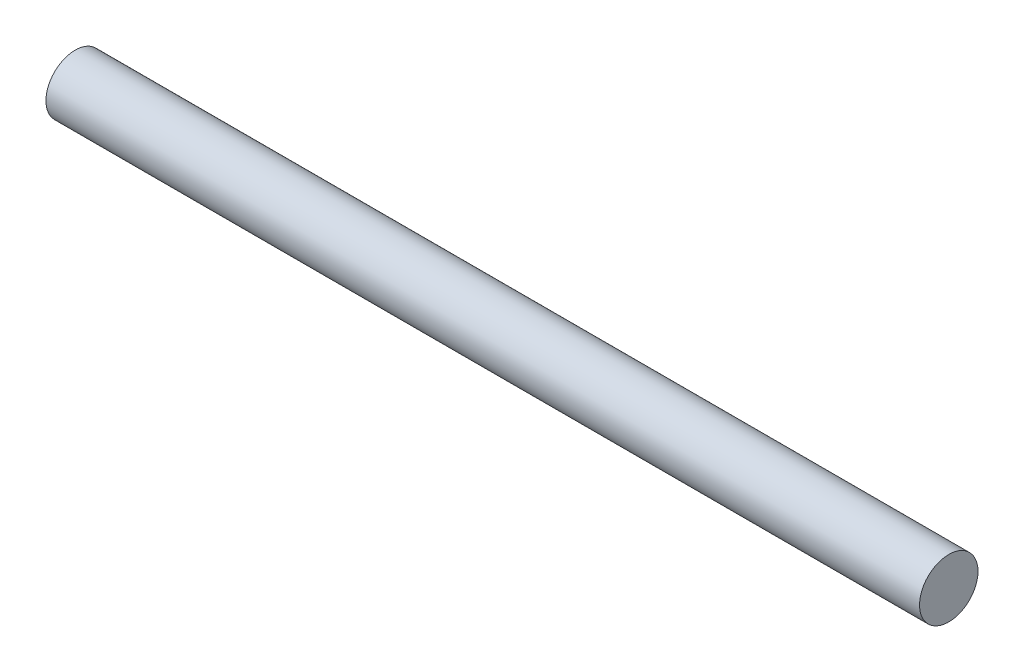
ISO-10303-21;
HEADER;
FILE_DESCRIPTION(('STEP AP214'),'2;1');
FILE_NAME('part.step','',(''),(''),'','','');
FILE_SCHEMA(('AUTOMOTIVE_DESIGN { 1 0 10303 214 1 1 1 1 }'));
ENDSEC;
DATA;
#1=APPLICATION_CONTEXT('core data for automotive mechanical design processes');
#2=APPLICATION_PROTOCOL_DEFINITION('international standard','automotive_design',2000,#1);
#3=PRODUCT_CONTEXT('',#1,'mechanical');
#4=PRODUCT('Part','Part','',(#3));
#5=PRODUCT_RELATED_PRODUCT_CATEGORY('part','',(#4));
#6=PRODUCT_DEFINITION_FORMATION('','',#4);
#7=PRODUCT_DEFINITION_CONTEXT('part definition',#1,'design');
#8=PRODUCT_DEFINITION('design','',#6,#7);
#9=PRODUCT_DEFINITION_SHAPE('','',#8);
#10=(LENGTH_UNIT() NAMED_UNIT(*) SI_UNIT(.MILLI.,.METRE.));
#11=(NAMED_UNIT(*) PLANE_ANGLE_UNIT() SI_UNIT($,.RADIAN.));
#12=(NAMED_UNIT(*) SI_UNIT($,.STERADIAN.) SOLID_ANGLE_UNIT());
#13=UNCERTAINTY_MEASURE_WITH_UNIT(LENGTH_MEASURE(1.E-05),#10,'distance_accuracy_value','');
#14=(GEOMETRIC_REPRESENTATION_CONTEXT(3) GLOBAL_UNCERTAINTY_ASSIGNED_CONTEXT((#13)) GLOBAL_UNIT_ASSIGNED_CONTEXT((#10,
#11,#12)) REPRESENTATION_CONTEXT('',''));
#15=CARTESIAN_POINT('',(0.,0.,0.));
#16=DIRECTION('',(0.,0.,1.));
#17=DIRECTION('',(1.,0.,0.));
#18=AXIS2_PLACEMENT_3D('',#15,#16,#17);
#19=CARTESIAN_POINT('',(254.,0.,0.));
#20=DIRECTION('',(-1.,0.,0.));
#21=DIRECTION('',(0.,0.,1.));
#22=AXIS2_PLACEMENT_3D('',#19,#20,#21);
#23=CYLINDRICAL_SURFACE('',#22,8.5);
#24=CARTESIAN_POINT('',(254.,0.,0.));
#25=DIRECTION('',(1.,0.,0.));
#26=DIRECTION('',(0.,0.,-1.));
#27=AXIS2_PLACEMENT_3D('',#24,#25,#26);
#28=CIRCLE('',#27,8.5);
#29=CARTESIAN_POINT('',(254.,0.,-8.5));
#30=VERTEX_POINT('',#29);
#31=EDGE_CURVE('E10',#30,#30,#28,.T.);
#32=ORIENTED_EDGE('',*,*,#31,.F.);
#33=EDGE_LOOP('',(#32));
#34=FACE_BOUND('',#33,.T.);
#35=CARTESIAN_POINT('',(0.,0.,0.));
#36=DIRECTION('',(1.,0.,0.));
#37=DIRECTION('',(0.,0.,-1.));
#38=AXIS2_PLACEMENT_3D('',#35,#36,#37);
#39=CIRCLE('',#38,8.5);
#40=CARTESIAN_POINT('',(0.,0.,-8.5));
#41=VERTEX_POINT('',#40);
#42=EDGE_CURVE('E40',#41,#41,#39,.T.);
#43=ORIENTED_EDGE('',*,*,#42,.T.);
#44=EDGE_LOOP('',(#43));
#45=FACE_BOUND('',#44,.T.);
#46=ADVANCED_FACE('F37',(#34,#45),#23,.T.);
#47=CARTESIAN_POINT('',(254.,0.,0.));
#48=DIRECTION('',(1.,0.,0.));
#49=DIRECTION('',(0.,0.,-1.));
#50=AXIS2_PLACEMENT_3D('',#47,#48,#49);
#51=PLANE('',#50);
#52=ORIENTED_EDGE('',*,*,#31,.T.);
#53=EDGE_LOOP('',(#52));
#54=FACE_BOUND('',#53,.T.);
#55=ADVANCED_FACE('F52',(#54),#51,.T.);
#56=CARTESIAN_POINT('',(0.,0.,0.));
#57=DIRECTION('',(1.,0.,0.));
#58=DIRECTION('',(0.,0.,-1.));
#59=AXIS2_PLACEMENT_3D('',#56,#57,#58);
#60=PLANE('',#59);
#61=ORIENTED_EDGE('',*,*,#42,.F.);
#62=EDGE_LOOP('',(#61));
#63=FACE_BOUND('',#62,.T.);
#64=ADVANCED_FACE('F50',(#63),#60,.F.);
#65=CLOSED_SHELL('',(#46,#55,#64));
#66=MANIFOLD_SOLID_BREP('B2',#65);
#67=ADVANCED_BREP_SHAPE_REPRESENTATION('',(#18,#66),#14);
#68=SHAPE_DEFINITION_REPRESENTATION(#9,#67);
ENDSEC;
END-ISO-10303-21;
